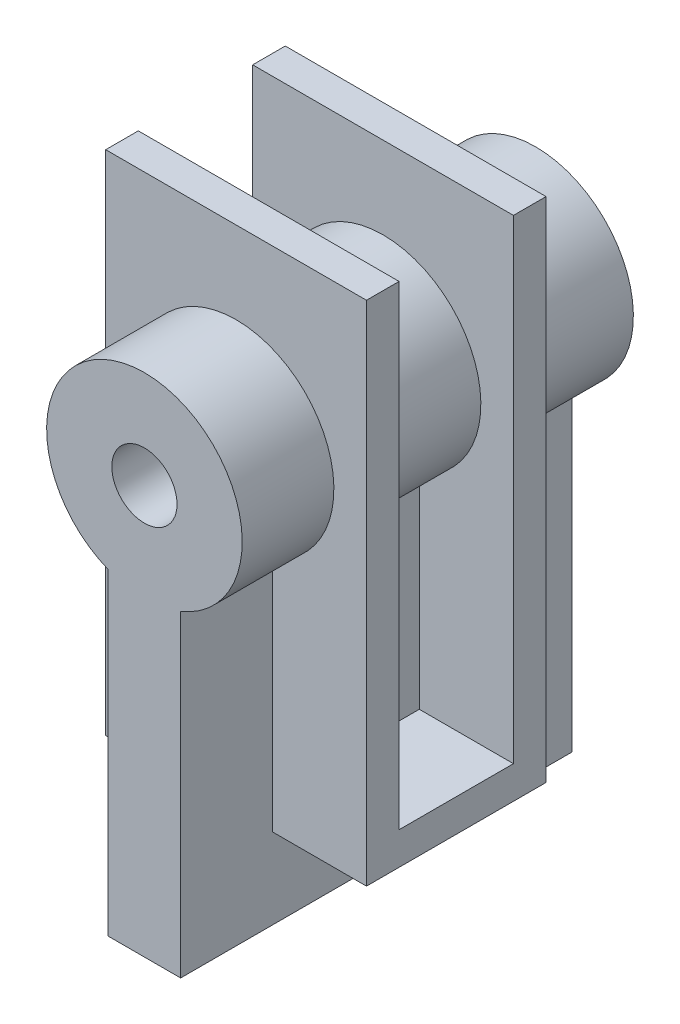
ISO-10303-21;
HEADER;
FILE_DESCRIPTION(('STEP AP214'),'2;1');
FILE_NAME('part.step','',(''),(''),'','','');
FILE_SCHEMA(('AUTOMOTIVE_DESIGN { 1 0 10303 214 1 1 1 1 }'));
ENDSEC;
DATA;
#1=APPLICATION_CONTEXT('core data for automotive mechanical design processes');
#2=APPLICATION_PROTOCOL_DEFINITION('international standard','automotive_design',2000,#1);
#3=PRODUCT_CONTEXT('',#1,'mechanical');
#4=PRODUCT('Part','Part','',(#3));
#5=PRODUCT_RELATED_PRODUCT_CATEGORY('part','',(#4));
#6=PRODUCT_DEFINITION_FORMATION('','',#4);
#7=PRODUCT_DEFINITION_CONTEXT('part definition',#1,'design');
#8=PRODUCT_DEFINITION('design','',#6,#7);
#9=PRODUCT_DEFINITION_SHAPE('','',#8);
#10=(LENGTH_UNIT() NAMED_UNIT(*) SI_UNIT(.MILLI.,.METRE.));
#11=(NAMED_UNIT(*) PLANE_ANGLE_UNIT() SI_UNIT($,.RADIAN.));
#12=(NAMED_UNIT(*) SI_UNIT($,.STERADIAN.) SOLID_ANGLE_UNIT());
#13=UNCERTAINTY_MEASURE_WITH_UNIT(LENGTH_MEASURE(1.E-05),#10,'distance_accuracy_value','');
#14=(GEOMETRIC_REPRESENTATION_CONTEXT(3) GLOBAL_UNCERTAINTY_ASSIGNED_CONTEXT((#13)) GLOBAL_UNIT_ASSIGNED_CONTEXT((#10,
#11,#12)) REPRESENTATION_CONTEXT('',''));
#15=CARTESIAN_POINT('',(0.,0.,0.));
#16=DIRECTION('',(0.,0.,1.));
#17=DIRECTION('',(1.,0.,0.));
#18=AXIS2_PLACEMENT_3D('',#15,#16,#17);
#19=CARTESIAN_POINT('',(0.,0.,-30.));
#20=DIRECTION('',(0.,0.,1.));
#21=DIRECTION('',(1.,0.,0.));
#22=AXIS2_PLACEMENT_3D('',#19,#20,#21);
#23=CYLINDRICAL_SURFACE('',#22,15.);
#24=CARTESIAN_POINT('',(0.,0.,15.9381302617935));
#25=DIRECTION('',(0.,0.,1.));
#26=DIRECTION('',(1.,0.,0.));
#27=AXIS2_PLACEMENT_3D('',#24,#25,#26);
#28=CIRCLE('',#27,15.);
#29=CARTESIAN_POINT('',(-5.5576064521285,-13.9324445279089,15.9381302617935));
#30=VERTEX_POINT('',#29);
#31=CARTESIAN_POINT('',(5.5576064521285,-13.9324445279089,15.9381302617935));
#32=VERTEX_POINT('',#31);
#33=EDGE_CURVE('E278',#30,#32,#28,.F.);
#34=ORIENTED_EDGE('',*,*,#33,.F.);
#35=DIRECTION('',(0.,0.,1.));
#36=VECTOR('',#35,1.);
#37=CARTESIAN_POINT('',(-5.5576064521285,-13.9324445279089,-30.));
#38=LINE('',#37,#36);
#39=CARTESIAN_POINT('',(-5.5576064521285,-13.9324445279089,30.));
#40=VERTEX_POINT('',#39);
#41=EDGE_CURVE('E333',#30,#40,#38,.T.);
#42=ORIENTED_EDGE('',*,*,#41,.T.);
#43=CARTESIAN_POINT('',(0.,0.,30.));
#44=DIRECTION('',(0.,0.,1.));
#45=DIRECTION('',(1.,0.,0.));
#46=AXIS2_PLACEMENT_3D('',#43,#44,#45);
#47=CIRCLE('',#46,15.);
#48=CARTESIAN_POINT('',(5.5576064521285,-13.9324445279089,30.));
#49=VERTEX_POINT('',#48);
#50=EDGE_CURVE('E306',#49,#40,#47,.T.);
#51=ORIENTED_EDGE('',*,*,#50,.F.);
#52=DIRECTION('',(0.,0.,1.));
#53=VECTOR('',#52,1.);
#54=CARTESIAN_POINT('',(5.5576064521285,-13.9324445279089,-30.));
#55=LINE('',#54,#53);
#56=EDGE_CURVE('E337',#32,#49,#55,.T.);
#57=ORIENTED_EDGE('',*,*,#56,.F.);
#58=EDGE_LOOP('',(#34,#42,#51,#57));
#59=FACE_BOUND('',#58,.T.);
#60=ADVANCED_FACE('F43',(#59),#23,.T.);
#61=CARTESIAN_POINT('',(5.5576064521285,-13.9324445279089,-30.));
#62=DIRECTION('',(1.,0.,0.));
#63=DIRECTION('',(0.,1.,0.));
#64=AXIS2_PLACEMENT_3D('',#61,#62,#63);
#65=PLANE('',#64);
#66=DIRECTION('',(0.,1.,0.));
#67=VECTOR('',#66,1.);
#68=CARTESIAN_POINT('',(5.5576064521285,-13.9324445279089,-11.6055019568257));
#69=LINE('',#68,#67);
#70=CARTESIAN_POINT('',(5.5576064521285,-50.2531458099855,-11.6055019568257));
#71=VERTEX_POINT('',#70);
#72=CARTESIAN_POINT('',(5.5576064521285,-13.9324445279089,-11.6055019568257));
#73=VERTEX_POINT('',#72);
#74=EDGE_CURVE('E59',#71,#73,#69,.T.);
#75=ORIENTED_EDGE('',*,*,#74,.F.);
#76=DIRECTION('',(0.,0.,-1.));
#77=VECTOR('',#76,1.);
#78=CARTESIAN_POINT('',(5.5576064521285,-50.2531458099855,-30.));
#79=LINE('',#78,#77);
#80=CARTESIAN_POINT('',(5.5576064521285,-50.2531458099855,15.9381302617935));
#81=VERTEX_POINT('',#80);
#82=EDGE_CURVE('E63',#81,#71,#79,.T.);
#83=ORIENTED_EDGE('',*,*,#82,.F.);
#84=DIRECTION('',(0.,-1.,0.));
#85=VECTOR('',#84,1.);
#86=CARTESIAN_POINT('',(5.5576064521285,-13.9324445279089,15.9381302617935));
#87=LINE('',#86,#85);
#88=EDGE_CURVE('E281',#32,#81,#87,.T.);
#89=ORIENTED_EDGE('',*,*,#88,.F.);
#90=ORIENTED_EDGE('',*,*,#56,.T.);
#91=DIRECTION('',(0.,1.,0.));
#92=VECTOR('',#91,1.);
#93=CARTESIAN_POINT('',(5.5576064521285,-13.9324445279089,30.));
#94=LINE('',#93,#92);
#95=CARTESIAN_POINT('',(5.5576064521285,-62.6422800075539,30.));
#96=VERTEX_POINT('',#95);
#97=EDGE_CURVE('E315',#96,#49,#94,.T.);
#98=ORIENTED_EDGE('',*,*,#97,.F.);
#99=DIRECTION('',(0.,0.,1.));
#100=VECTOR('',#99,1.);
#101=CARTESIAN_POINT('',(5.5576064521285,-62.6422800075539,-30.));
#102=LINE('',#101,#100);
#103=CARTESIAN_POINT('',(5.5576064521285,-62.6422800075539,-30.));
#104=VERTEX_POINT('',#103);
#105=EDGE_CURVE('E338',#104,#96,#102,.T.);
#106=ORIENTED_EDGE('',*,*,#105,.F.);
#107=DIRECTION('',(0.,1.,0.));
#108=VECTOR('',#107,1.);
#109=CARTESIAN_POINT('',(5.5576064521285,-13.9324445279089,-30.));
#110=LINE('',#109,#108);
#111=CARTESIAN_POINT('',(5.5576064521285,-13.9324445279089,-30.));
#112=VERTEX_POINT('',#111);
#113=EDGE_CURVE('E330',#104,#112,#110,.T.);
#114=ORIENTED_EDGE('',*,*,#113,.T.);
#115=EDGE_CURVE('E334',#112,#73,#55,.T.);
#116=ORIENTED_EDGE('',*,*,#115,.T.);
#117=EDGE_LOOP('',(#75,#83,#89,#90,#98,#106,#114,#116));
#118=FACE_BOUND('',#117,.T.);
#119=ADVANCED_FACE('F387',(#118),#65,.T.);
#120=CARTESIAN_POINT('',(-5.5576064521285,-13.9324445279089,-30.));
#121=DIRECTION('',(-1.,0.,0.));
#122=DIRECTION('',(0.,0.,1.));
#123=AXIS2_PLACEMENT_3D('',#120,#121,#122);
#124=PLANE('',#123);
#125=DIRECTION('',(0.,-1.,0.));
#126=VECTOR('',#125,1.);
#127=CARTESIAN_POINT('',(-5.5576064521285,-13.9324445279089,-11.6055019568257));
#128=LINE('',#127,#126);
#129=CARTESIAN_POINT('',(-5.5576064521285,-13.9324445279089,-11.6055019568257));
#130=VERTEX_POINT('',#129);
#131=CARTESIAN_POINT('',(-5.5576064521285,-50.2531458099855,-11.6055019568257));
#132=VERTEX_POINT('',#131);
#133=EDGE_CURVE('E284',#130,#132,#128,.T.);
#134=ORIENTED_EDGE('',*,*,#133,.F.);
#135=CARTESIAN_POINT('',(-5.5576064521285,-13.9324445279089,-30.));
#136=VERTEX_POINT('',#135);
#137=EDGE_CURVE('E342',#136,#130,#38,.T.);
#138=ORIENTED_EDGE('',*,*,#137,.F.);
#139=DIRECTION('',(0.,-1.,0.));
#140=VECTOR('',#139,1.);
#141=CARTESIAN_POINT('',(-5.5576064521285,-13.9324445279089,-30.));
#142=LINE('',#141,#140);
#143=CARTESIAN_POINT('',(-5.5576064521285,-62.6422800075539,-30.));
#144=VERTEX_POINT('',#143);
#145=EDGE_CURVE('E324',#136,#144,#142,.T.);
#146=ORIENTED_EDGE('',*,*,#145,.T.);
#147=DIRECTION('',(0.,0.,1.));
#148=VECTOR('',#147,1.);
#149=CARTESIAN_POINT('',(-5.5576064521285,-62.6422800075539,-30.));
#150=LINE('',#149,#148);
#151=CARTESIAN_POINT('',(-5.5576064521285,-62.6422800075539,30.));
#152=VERTEX_POINT('',#151);
#153=EDGE_CURVE('E340',#144,#152,#150,.T.);
#154=ORIENTED_EDGE('',*,*,#153,.T.);
#155=DIRECTION('',(0.,-1.,0.));
#156=VECTOR('',#155,1.);
#157=CARTESIAN_POINT('',(-5.5576064521285,-13.9324445279089,30.));
#158=LINE('',#157,#156);
#159=EDGE_CURVE('E309',#40,#152,#158,.T.);
#160=ORIENTED_EDGE('',*,*,#159,.F.);
#161=ORIENTED_EDGE('',*,*,#41,.F.);
#162=DIRECTION('',(0.,1.,0.));
#163=VECTOR('',#162,1.);
#164=CARTESIAN_POINT('',(-5.5576064521285,-13.9324445279089,15.9381302617935));
#165=LINE('',#164,#163);
#166=CARTESIAN_POINT('',(-5.5576064521285,-50.2531458099855,15.9381302617935));
#167=VERTEX_POINT('',#166);
#168=EDGE_CURVE('E275',#167,#30,#165,.T.);
#169=ORIENTED_EDGE('',*,*,#168,.F.);
#170=DIRECTION('',(0.,0.,1.));
#171=VECTOR('',#170,1.);
#172=CARTESIAN_POINT('',(-5.5576064521285,-50.2531458099855,-30.));
#173=LINE('',#172,#171);
#174=EDGE_CURVE('E11',#132,#167,#173,.T.);
#175=ORIENTED_EDGE('',*,*,#174,.F.);
#176=EDGE_LOOP('',(#134,#138,#146,#154,#160,#161,#169,#175));
#177=FACE_BOUND('',#176,.T.);
#178=ADVANCED_FACE('F381',(#177),#124,.T.);
#179=CARTESIAN_POINT('',(0.,0.,-30.));
#180=DIRECTION('',(0.,0.,1.));
#181=DIRECTION('',(1.,0.,0.));
#182=AXIS2_PLACEMENT_3D('',#179,#180,#181);
#183=CYLINDRICAL_SURFACE('',#182,5.);
#184=CARTESIAN_POINT('',(0.,0.,15.9381302617935));
#185=DIRECTION('',(0.,0.,1.));
#186=DIRECTION('',(1.,0.,0.));
#187=AXIS2_PLACEMENT_3D('',#184,#185,#186);
#188=CIRCLE('',#187,5.);
#189=CARTESIAN_POINT('',(5.,0.,15.9381302617935));
#190=VERTEX_POINT('',#189);
#191=EDGE_CURVE('E274',#190,#190,#188,.F.);
#192=ORIENTED_EDGE('',*,*,#191,.T.);
#193=EDGE_LOOP('',(#192));
#194=FACE_BOUND('',#193,.T.);
#195=CARTESIAN_POINT('',(0.,0.,30.));
#196=DIRECTION('',(0.,0.,1.));
#197=DIRECTION('',(1.,0.,0.));
#198=AXIS2_PLACEMENT_3D('',#195,#196,#197);
#199=CIRCLE('',#198,5.);
#200=CARTESIAN_POINT('',(5.,0.,30.));
#201=VERTEX_POINT('',#200);
#202=EDGE_CURVE('E303',#201,#201,#199,.T.);
#203=ORIENTED_EDGE('',*,*,#202,.T.);
#204=EDGE_LOOP('',(#203));
#205=FACE_BOUND('',#204,.T.);
#206=ADVANCED_FACE('F405',(#194,#205),#183,.F.);
#207=CARTESIAN_POINT('',(0.,0.,-11.6055019568257));
#208=DIRECTION('',(0.,0.,-1.));
#209=DIRECTION('',(-1.,0.,0.));
#210=AXIS2_PLACEMENT_3D('',#207,#208,#209);
#211=CIRCLE('',#210,15.);
#212=EDGE_CURVE('E287',#73,#130,#211,.F.);
#213=ORIENTED_EDGE('',*,*,#212,.F.);
#214=ORIENTED_EDGE('',*,*,#115,.F.);
#215=CARTESIAN_POINT('',(0.,0.,-30.));
#216=DIRECTION('',(0.,0.,1.));
#217=DIRECTION('',(1.,0.,0.));
#218=AXIS2_PLACEMENT_3D('',#215,#216,#217);
#219=CIRCLE('',#218,15.);
#220=EDGE_CURVE('E321',#112,#136,#219,.T.);
#221=ORIENTED_EDGE('',*,*,#220,.T.);
#222=ORIENTED_EDGE('',*,*,#137,.T.);
#223=EDGE_LOOP('',(#213,#214,#221,#222));
#224=FACE_BOUND('',#223,.T.);
#225=ADVANCED_FACE('F45',(#224),#23,.T.);
#226=CARTESIAN_POINT('',(-5.5576064521285,-62.6422800075539,-30.));
#227=DIRECTION('',(0.,-1.,0.));
#228=DIRECTION('',(0.,0.,-1.));
#229=AXIS2_PLACEMENT_3D('',#226,#227,#228);
#230=PLANE('',#229);
#231=ORIENTED_EDGE('',*,*,#105,.T.);
#232=DIRECTION('',(1.,0.,0.));
#233=VECTOR('',#232,1.);
#234=CARTESIAN_POINT('',(-5.5576064521285,-62.6422800075539,30.));
#235=LINE('',#234,#233);
#236=EDGE_CURVE('E312',#152,#96,#235,.T.);
#237=ORIENTED_EDGE('',*,*,#236,.F.);
#238=ORIENTED_EDGE('',*,*,#153,.F.);
#239=DIRECTION('',(1.,0.,0.));
#240=VECTOR('',#239,1.);
#241=CARTESIAN_POINT('',(-5.5576064521285,-62.6422800075539,-30.));
#242=LINE('',#241,#240);
#243=EDGE_CURVE('E327',#144,#104,#242,.T.);
#244=ORIENTED_EDGE('',*,*,#243,.T.);
#245=EDGE_LOOP('',(#231,#237,#238,#244));
#246=FACE_BOUND('',#245,.T.);
#247=ADVANCED_FACE('F404',(#246),#230,.T.);
#248=CARTESIAN_POINT('',(0.,0.,-30.));
#249=DIRECTION('',(0.,0.,1.));
#250=DIRECTION('',(1.,0.,0.));
#251=AXIS2_PLACEMENT_3D('',#248,#249,#250);
#252=PLANE('',#251);
#253=CARTESIAN_POINT('',(0.,0.,-30.));
#254=DIRECTION('',(0.,0.,1.));
#255=DIRECTION('',(1.,0.,0.));
#256=AXIS2_PLACEMENT_3D('',#253,#254,#255);
#257=CIRCLE('',#256,5.);
#258=CARTESIAN_POINT('',(5.,0.,-30.));
#259=VERTEX_POINT('',#258);
#260=EDGE_CURVE('E318',#259,#259,#257,.T.);
#261=ORIENTED_EDGE('',*,*,#260,.T.);
#262=EDGE_LOOP('',(#261));
#263=FACE_BOUND('',#262,.T.);
#264=ORIENTED_EDGE('',*,*,#220,.F.);
#265=ORIENTED_EDGE('',*,*,#113,.F.);
#266=ORIENTED_EDGE('',*,*,#243,.F.);
#267=ORIENTED_EDGE('',*,*,#145,.F.);
#268=EDGE_LOOP('',(#264,#265,#266,#267));
#269=FACE_BOUND('',#268,.T.);
#270=ADVANCED_FACE('F593',(#263,#269),#252,.F.);
#271=CARTESIAN_POINT('',(0.,0.,-11.6055019568257));
#272=DIRECTION('',(0.,0.,-1.));
#273=DIRECTION('',(-1.,0.,0.));
#274=AXIS2_PLACEMENT_3D('',#271,#272,#273);
#275=CIRCLE('',#274,5.);
#276=CARTESIAN_POINT('',(-5.,0.,-11.6055019568257));
#277=VERTEX_POINT('',#276);
#278=EDGE_CURVE('E283',#277,#277,#275,.F.);
#279=ORIENTED_EDGE('',*,*,#278,.T.);
#280=EDGE_LOOP('',(#279));
#281=FACE_BOUND('',#280,.T.);
#282=ORIENTED_EDGE('',*,*,#260,.F.);
#283=EDGE_LOOP('',(#282));
#284=FACE_BOUND('',#283,.T.);
#285=ADVANCED_FACE('F421',(#281,#284),#183,.F.);
#286=CARTESIAN_POINT('',(0.,0.,30.));
#287=DIRECTION('',(0.,0.,1.));
#288=DIRECTION('',(1.,0.,0.));
#289=AXIS2_PLACEMENT_3D('',#286,#287,#288);
#290=PLANE('',#289);
#291=ORIENTED_EDGE('',*,*,#50,.T.);
#292=ORIENTED_EDGE('',*,*,#159,.T.);
#293=ORIENTED_EDGE('',*,*,#236,.T.);
#294=ORIENTED_EDGE('',*,*,#97,.T.);
#295=EDGE_LOOP('',(#291,#292,#293,#294));
#296=FACE_BOUND('',#295,.T.);
#297=ORIENTED_EDGE('',*,*,#202,.F.);
#298=EDGE_LOOP('',(#297));
#299=FACE_BOUND('',#298,.T.);
#300=ADVANCED_FACE('F384',(#296,#299),#290,.T.);
#301=CARTESIAN_POINT('',(-20.,-50.2531458099855,15.9381302617935));
#302=DIRECTION('',(0.,0.,1.));
#303=DIRECTION('',(1.,0.,0.));
#304=AXIS2_PLACEMENT_3D('',#301,#302,#303);
#305=PLANE('',#304);
#306=ORIENTED_EDGE('',*,*,#191,.F.);
#307=EDGE_LOOP('',(#306));
#308=FACE_BOUND('',#307,.T.);
#309=ADVANCED_FACE('F514',(#308),#305,.T.);
#310=CARTESIAN_POINT('',(-20.,-50.2531458099855,-11.6055019568257));
#311=DIRECTION('',(0.,0.,-1.));
#312=DIRECTION('',(-1.,0.,0.));
#313=AXIS2_PLACEMENT_3D('',#310,#311,#312);
#314=PLANE('',#313);
#315=ORIENTED_EDGE('',*,*,#278,.F.);
#316=EDGE_LOOP('',(#315));
#317=FACE_BOUND('',#316,.T.);
#318=ADVANCED_FACE('F536',(#317),#314,.T.);
#319=CARTESIAN_POINT('',(-20.,-45.2531458099855,-6.6055019568257));
#320=DIRECTION('',(0.,1.,0.));
#321=DIRECTION('',(0.,0.,1.));
#322=AXIS2_PLACEMENT_3D('',#319,#320,#321);
#323=PLANE('',#322);
#324=DIRECTION('',(1.,0.,0.));
#325=VECTOR('',#324,1.);
#326=CARTESIAN_POINT('',(-20.,-45.2531458099855,-6.6055019568257));
#327=LINE('',#326,#325);
#328=CARTESIAN_POINT('',(5.5576064521285,-45.2531458099855,-6.6055019568257));
#329=VERTEX_POINT('',#328);
#330=CARTESIAN_POINT('',(20.,-45.2531458099855,-6.6055019568257));
#331=VERTEX_POINT('',#330);
#332=EDGE_CURVE('E249',#329,#331,#327,.T.);
#333=ORIENTED_EDGE('',*,*,#332,.F.);
#334=DIRECTION('',(0.,0.,1.));
#335=VECTOR('',#334,1.);
#336=CARTESIAN_POINT('',(5.5576064521285,-45.2531458099855,-30.));
#337=LINE('',#336,#335);
#338=CARTESIAN_POINT('',(5.5576064521285,-45.2531458099855,10.9381302617935));
#339=VERTEX_POINT('',#338);
#340=EDGE_CURVE('E187',#329,#339,#337,.T.);
#341=ORIENTED_EDGE('',*,*,#340,.T.);
#342=DIRECTION('',(1.,0.,0.));
#343=VECTOR('',#342,1.);
#344=CARTESIAN_POINT('',(-20.,-45.2531458099855,10.9381302617935));
#345=LINE('',#344,#343);
#346=CARTESIAN_POINT('',(20.,-45.2531458099855,10.9381302617935));
#347=VERTEX_POINT('',#346);
#348=EDGE_CURVE('E181',#339,#347,#345,.T.);
#349=ORIENTED_EDGE('',*,*,#348,.T.);
#350=DIRECTION('',(0.,0.,1.));
#351=VECTOR('',#350,1.);
#352=CARTESIAN_POINT('',(20.,-45.2531458099855,-6.6055019568257));
#353=LINE('',#352,#351);
#354=EDGE_CURVE('E186',#331,#347,#353,.T.);
#355=ORIENTED_EDGE('',*,*,#354,.F.);
#356=EDGE_LOOP('',(#333,#341,#349,#355));
#357=FACE_BOUND('',#356,.T.);
#358=ADVANCED_FACE('F184',(#357),#323,.T.);
#359=CARTESIAN_POINT('',(-20.,-50.2531458099855,-11.6055019568257));
#360=DIRECTION('',(0.,-1.,0.));
#361=DIRECTION('',(0.,0.,-1.));
#362=AXIS2_PLACEMENT_3D('',#359,#360,#361);
#363=PLANE('',#362);
#364=DIRECTION('',(1.,0.,0.));
#365=VECTOR('',#364,1.);
#366=CARTESIAN_POINT('',(-20.,-50.2531458099855,15.9381302617935));
#367=LINE('',#366,#365);
#368=CARTESIAN_POINT('',(20.,-50.2531458099855,15.9381302617935));
#369=VERTEX_POINT('',#368);
#370=EDGE_CURVE('E261',#81,#369,#367,.T.);
#371=ORIENTED_EDGE('',*,*,#370,.F.);
#372=ORIENTED_EDGE('',*,*,#82,.T.);
#373=DIRECTION('',(1.,0.,0.));
#374=VECTOR('',#373,1.);
#375=CARTESIAN_POINT('',(-20.,-50.2531458099855,-11.6055019568257));
#376=LINE('',#375,#374);
#377=CARTESIAN_POINT('',(20.,-50.2531458099855,-11.6055019568257));
#378=VERTEX_POINT('',#377);
#379=EDGE_CURVE('E257',#71,#378,#376,.T.);
#380=ORIENTED_EDGE('',*,*,#379,.T.);
#381=DIRECTION('',(0.,0.,-1.));
#382=VECTOR('',#381,1.);
#383=CARTESIAN_POINT('',(20.,-50.2531458099855,-11.6055019568257));
#384=LINE('',#383,#382);
#385=EDGE_CURVE('E214',#369,#378,#384,.T.);
#386=ORIENTED_EDGE('',*,*,#385,.F.);
#387=EDGE_LOOP('',(#371,#372,#380,#386));
#388=FACE_BOUND('',#387,.T.);
#389=ADVANCED_FACE('F525',(#388),#363,.T.);
#390=CARTESIAN_POINT('',(-20.,-45.2531458099855,10.9381302617935));
#391=VERTEX_POINT('',#390);
#392=CARTESIAN_POINT('',(-5.5576064521285,-45.2531458099855,10.9381302617935));
#393=VERTEX_POINT('',#392);
#394=EDGE_CURVE('E190',#391,#393,#345,.T.);
#395=ORIENTED_EDGE('',*,*,#394,.T.);
#396=DIRECTION('',(0.,0.,-1.));
#397=VECTOR('',#396,1.);
#398=CARTESIAN_POINT('',(-5.5576064521285,-45.2531458099855,-30.));
#399=LINE('',#398,#397);
#400=CARTESIAN_POINT('',(-5.5576064521285,-45.2531458099855,-6.6055019568257));
#401=VERTEX_POINT('',#400);
#402=EDGE_CURVE('E52',#393,#401,#399,.T.);
#403=ORIENTED_EDGE('',*,*,#402,.T.);
#404=CARTESIAN_POINT('',(-20.,-45.2531458099855,-6.6055019568257));
#405=VERTEX_POINT('',#404);
#406=EDGE_CURVE('E245',#405,#401,#327,.T.);
#407=ORIENTED_EDGE('',*,*,#406,.F.);
#408=DIRECTION('',(0.,0.,1.));
#409=VECTOR('',#408,1.);
#410=CARTESIAN_POINT('',(-20.,-45.2531458099855,-6.6055019568257));
#411=LINE('',#410,#409);
#412=EDGE_CURVE('E223',#405,#391,#411,.T.);
#413=ORIENTED_EDGE('',*,*,#412,.T.);
#414=EDGE_LOOP('',(#395,#403,#407,#413));
#415=FACE_BOUND('',#414,.T.);
#416=ADVANCED_FACE('F355',(#415),#323,.T.);
#417=CARTESIAN_POINT('',(-20.,-45.2531458099855,-6.6055019568257));
#418=DIRECTION('',(0.,0.,1.));
#419=DIRECTION('',(1.,0.,0.));
#420=AXIS2_PLACEMENT_3D('',#417,#418,#419);
#421=PLANE('',#420);
#422=CARTESIAN_POINT('',(0.,0.,-6.6055019568257));
#423=DIRECTION('',(0.,0.,1.));
#424=DIRECTION('',(1.,0.,0.));
#425=AXIS2_PLACEMENT_3D('',#422,#423,#424);
#426=CIRCLE('',#425,15.);
#427=CARTESIAN_POINT('',(-5.5576064521285,-13.9324445279089,-6.6055019568257));
#428=VERTEX_POINT('',#427);
#429=CARTESIAN_POINT('',(5.5576064521285,-13.9324445279089,-6.6055019568257));
#430=VERTEX_POINT('',#429);
#431=EDGE_CURVE('E295',#428,#430,#426,.F.);
#432=ORIENTED_EDGE('',*,*,#431,.T.);
#433=DIRECTION('',(0.,-1.,0.));
#434=VECTOR('',#433,1.);
#435=CARTESIAN_POINT('',(5.5576064521285,-13.9324445279089,-6.6055019568257));
#436=LINE('',#435,#434);
#437=EDGE_CURVE('E298',#430,#329,#436,.T.);
#438=ORIENTED_EDGE('',*,*,#437,.T.);
#439=ORIENTED_EDGE('',*,*,#332,.T.);
#440=DIRECTION('',(0.,-1.,0.));
#441=VECTOR('',#440,1.);
#442=CARTESIAN_POINT('',(20.,-45.2531458099855,-6.6055019568257));
#443=LINE('',#442,#441);
#444=CARTESIAN_POINT('',(20.,27.5804653060911,-6.6055019568257));
#445=VERTEX_POINT('',#444);
#446=EDGE_CURVE('E207',#445,#331,#443,.T.);
#447=ORIENTED_EDGE('',*,*,#446,.F.);
#448=DIRECTION('',(1.,0.,0.));
#449=VECTOR('',#448,1.);
#450=CARTESIAN_POINT('',(-20.,27.5804653060911,-6.6055019568257));
#451=LINE('',#450,#449);
#452=CARTESIAN_POINT('',(-20.,27.5804653060911,-6.6055019568257));
#453=VERTEX_POINT('',#452);
#454=EDGE_CURVE('E250',#453,#445,#451,.T.);
#455=ORIENTED_EDGE('',*,*,#454,.F.);
#456=DIRECTION('',(0.,-1.,0.));
#457=VECTOR('',#456,1.);
#458=CARTESIAN_POINT('',(-20.,-45.2531458099855,-6.6055019568257));
#459=LINE('',#458,#457);
#460=EDGE_CURVE('E191',#453,#405,#459,.T.);
#461=ORIENTED_EDGE('',*,*,#460,.T.);
#462=ORIENTED_EDGE('',*,*,#406,.T.);
#463=DIRECTION('',(0.,1.,0.));
#464=VECTOR('',#463,1.);
#465=CARTESIAN_POINT('',(-5.5576064521285,-13.9324445279089,-6.6055019568257));
#466=LINE('',#465,#464);
#467=EDGE_CURVE('E292',#401,#428,#466,.T.);
#468=ORIENTED_EDGE('',*,*,#467,.T.);
#469=EDGE_LOOP('',(#432,#438,#439,#447,#455,#461,#462,#468));
#470=FACE_BOUND('',#469,.T.);
#471=ADVANCED_FACE('F359',(#470),#421,.T.);
#472=CARTESIAN_POINT('',(-20.,27.5804653060911,-6.6055019568257));
#473=DIRECTION('',(0.,1.,0.));
#474=DIRECTION('',(0.,0.,1.));
#475=AXIS2_PLACEMENT_3D('',#472,#473,#474);
#476=PLANE('',#475);
#477=ORIENTED_EDGE('',*,*,#454,.T.);
#478=DIRECTION('',(0.,0.,1.));
#479=VECTOR('',#478,1.);
#480=CARTESIAN_POINT('',(20.,27.5804653060911,-6.6055019568257));
#481=LINE('',#480,#479);
#482=CARTESIAN_POINT('',(20.,27.5804653060911,-11.6055019568257));
#483=VERTEX_POINT('',#482);
#484=EDGE_CURVE('E220',#483,#445,#481,.T.);
#485=ORIENTED_EDGE('',*,*,#484,.F.);
#486=DIRECTION('',(1.,0.,0.));
#487=VECTOR('',#486,1.);
#488=CARTESIAN_POINT('',(-20.,27.5804653060911,-11.6055019568257));
#489=LINE('',#488,#487);
#490=CARTESIAN_POINT('',(-20.,27.5804653060911,-11.6055019568257));
#491=VERTEX_POINT('',#490);
#492=EDGE_CURVE('E252',#491,#483,#489,.T.);
#493=ORIENTED_EDGE('',*,*,#492,.F.);
#494=DIRECTION('',(0.,0.,1.));
#495=VECTOR('',#494,1.);
#496=CARTESIAN_POINT('',(-20.,27.5804653060911,-6.6055019568257));
#497=LINE('',#496,#495);
#498=EDGE_CURVE('E240',#491,#453,#497,.T.);
#499=ORIENTED_EDGE('',*,*,#498,.T.);
#500=EDGE_LOOP('',(#477,#485,#493,#499));
#501=FACE_BOUND('',#500,.T.);
#502=ADVANCED_FACE('F533',(#501),#476,.T.);
#503=ORIENTED_EDGE('',*,*,#379,.F.);
#504=ORIENTED_EDGE('',*,*,#74,.T.);
#505=ORIENTED_EDGE('',*,*,#212,.T.);
#506=ORIENTED_EDGE('',*,*,#133,.T.);
#507=CARTESIAN_POINT('',(-20.,-50.2531458099855,-11.6055019568257));
#508=VERTEX_POINT('',#507);
#509=EDGE_CURVE('E254',#508,#132,#376,.T.);
#510=ORIENTED_EDGE('',*,*,#509,.F.);
#511=DIRECTION('',(0.,1.,0.));
#512=VECTOR('',#511,1.);
#513=CARTESIAN_POINT('',(-20.,-50.2531458099855,-11.6055019568257));
#514=LINE('',#513,#512);
#515=EDGE_CURVE('E237',#508,#491,#514,.T.);
#516=ORIENTED_EDGE('',*,*,#515,.T.);
#517=ORIENTED_EDGE('',*,*,#492,.T.);
#518=DIRECTION('',(0.,1.,0.));
#519=VECTOR('',#518,1.);
#520=CARTESIAN_POINT('',(20.,-50.2531458099855,-11.6055019568257));
#521=LINE('',#520,#519);
#522=EDGE_CURVE('E217',#378,#483,#521,.T.);
#523=ORIENTED_EDGE('',*,*,#522,.F.);
#524=EDGE_LOOP('',(#503,#504,#505,#506,#510,#516,#517,#523));
#525=FACE_BOUND('',#524,.T.);
#526=ADVANCED_FACE('F522',(#525),#314,.T.);
#527=ORIENTED_EDGE('',*,*,#509,.T.);
#528=ORIENTED_EDGE('',*,*,#174,.T.);
#529=CARTESIAN_POINT('',(-20.,-50.2531458099855,15.9381302617935));
#530=VERTEX_POINT('',#529);
#531=EDGE_CURVE('E258',#530,#167,#367,.T.);
#532=ORIENTED_EDGE('',*,*,#531,.F.);
#533=DIRECTION('',(0.,0.,-1.));
#534=VECTOR('',#533,1.);
#535=CARTESIAN_POINT('',(-20.,-50.2531458099855,-11.6055019568257));
#536=LINE('',#535,#534);
#537=EDGE_CURVE('E234',#530,#508,#536,.T.);
#538=ORIENTED_EDGE('',*,*,#537,.T.);
#539=EDGE_LOOP('',(#527,#528,#532,#538));
#540=FACE_BOUND('',#539,.T.);
#541=ADVANCED_FACE('F511',(#540),#363,.T.);
#542=ORIENTED_EDGE('',*,*,#33,.T.);
#543=ORIENTED_EDGE('',*,*,#88,.T.);
#544=ORIENTED_EDGE('',*,*,#370,.T.);
#545=DIRECTION('',(0.,-1.,0.));
#546=VECTOR('',#545,1.);
#547=CARTESIAN_POINT('',(20.,-50.2531458099855,15.9381302617935));
#548=LINE('',#547,#546);
#549=CARTESIAN_POINT('',(20.,27.5804653060911,15.9381302617935));
#550=VERTEX_POINT('',#549);
#551=EDGE_CURVE('E211',#550,#369,#548,.T.);
#552=ORIENTED_EDGE('',*,*,#551,.F.);
#553=DIRECTION('',(1.,0.,0.));
#554=VECTOR('',#553,1.);
#555=CARTESIAN_POINT('',(-20.,27.5804653060911,15.9381302617935));
#556=LINE('',#555,#554);
#557=CARTESIAN_POINT('',(-20.,27.5804653060911,15.9381302617935));
#558=VERTEX_POINT('',#557);
#559=EDGE_CURVE('E262',#558,#550,#556,.T.);
#560=ORIENTED_EDGE('',*,*,#559,.F.);
#561=DIRECTION('',(0.,-1.,0.));
#562=VECTOR('',#561,1.);
#563=CARTESIAN_POINT('',(-20.,-50.2531458099855,15.9381302617935));
#564=LINE('',#563,#562);
#565=EDGE_CURVE('E231',#558,#530,#564,.T.);
#566=ORIENTED_EDGE('',*,*,#565,.T.);
#567=ORIENTED_EDGE('',*,*,#531,.T.);
#568=ORIENTED_EDGE('',*,*,#168,.T.);
#569=EDGE_LOOP('',(#542,#543,#544,#552,#560,#566,#567,#568));
#570=FACE_BOUND('',#569,.T.);
#571=ADVANCED_FACE('F501',(#570),#305,.T.);
#572=CARTESIAN_POINT('',(-20.,27.5804653060911,15.9381302617935));
#573=DIRECTION('',(0.,1.,0.));
#574=DIRECTION('',(0.,0.,1.));
#575=AXIS2_PLACEMENT_3D('',#572,#573,#574);
#576=PLANE('',#575);
#577=ORIENTED_EDGE('',*,*,#559,.T.);
#578=DIRECTION('',(0.,0.,1.));
#579=VECTOR('',#578,1.);
#580=CARTESIAN_POINT('',(20.,27.5804653060911,15.9381302617935));
#581=LINE('',#580,#579);
#582=CARTESIAN_POINT('',(20.,27.5804653060911,10.9381302617935));
#583=VERTEX_POINT('',#582);
#584=EDGE_CURVE('E201',#583,#550,#581,.T.);
#585=ORIENTED_EDGE('',*,*,#584,.F.);
#586=DIRECTION('',(1.,0.,0.));
#587=VECTOR('',#586,1.);
#588=CARTESIAN_POINT('',(-20.,27.5804653060911,10.9381302617935));
#589=LINE('',#588,#587);
#590=CARTESIAN_POINT('',(-20.,27.5804653060911,10.9381302617935));
#591=VERTEX_POINT('',#590);
#592=EDGE_CURVE('E197',#591,#583,#589,.T.);
#593=ORIENTED_EDGE('',*,*,#592,.F.);
#594=DIRECTION('',(0.,0.,1.));
#595=VECTOR('',#594,1.);
#596=CARTESIAN_POINT('',(-20.,27.5804653060911,15.9381302617935));
#597=LINE('',#596,#595);
#598=EDGE_CURVE('E228',#591,#558,#597,.T.);
#599=ORIENTED_EDGE('',*,*,#598,.T.);
#600=EDGE_LOOP('',(#577,#585,#593,#599));
#601=FACE_BOUND('',#600,.T.);
#602=ADVANCED_FACE('F493',(#601),#576,.T.);
#603=CARTESIAN_POINT('',(-20.,-45.2531458099855,10.9381302617935));
#604=DIRECTION('',(0.,0.,-1.));
#605=DIRECTION('',(-1.,0.,0.));
#606=AXIS2_PLACEMENT_3D('',#603,#604,#605);
#607=PLANE('',#606);
#608=ORIENTED_EDGE('',*,*,#348,.F.);
#609=DIRECTION('',(0.,1.,0.));
#610=VECTOR('',#609,1.);
#611=CARTESIAN_POINT('',(5.5576064521285,-13.9324445279089,10.9381302617935));
#612=LINE('',#611,#610);
#613=CARTESIAN_POINT('',(5.5576064521285,-13.9324445279089,10.9381302617935));
#614=VERTEX_POINT('',#613);
#615=EDGE_CURVE('E272',#339,#614,#612,.T.);
#616=ORIENTED_EDGE('',*,*,#615,.T.);
#617=CARTESIAN_POINT('',(0.,0.,10.9381302617935));
#618=DIRECTION('',(0.,0.,-1.));
#619=DIRECTION('',(-1.,0.,0.));
#620=AXIS2_PLACEMENT_3D('',#617,#618,#619);
#621=CIRCLE('',#620,15.);
#622=CARTESIAN_POINT('',(-5.5576064521285,-13.9324445279089,10.9381302617935));
#623=VERTEX_POINT('',#622);
#624=EDGE_CURVE('E269',#614,#623,#621,.F.);
#625=ORIENTED_EDGE('',*,*,#624,.T.);
#626=DIRECTION('',(0.,-1.,0.));
#627=VECTOR('',#626,1.);
#628=CARTESIAN_POINT('',(-5.5576064521285,-13.9324445279089,10.9381302617935));
#629=LINE('',#628,#627);
#630=EDGE_CURVE('E266',#623,#393,#629,.T.);
#631=ORIENTED_EDGE('',*,*,#630,.T.);
#632=ORIENTED_EDGE('',*,*,#394,.F.);
#633=DIRECTION('',(0.,1.,0.));
#634=VECTOR('',#633,1.);
#635=CARTESIAN_POINT('',(-20.,-45.2531458099855,10.9381302617935));
#636=LINE('',#635,#634);
#637=EDGE_CURVE('E226',#391,#591,#636,.T.);
#638=ORIENTED_EDGE('',*,*,#637,.T.);
#639=ORIENTED_EDGE('',*,*,#592,.T.);
#640=DIRECTION('',(0.,1.,0.));
#641=VECTOR('',#640,1.);
#642=CARTESIAN_POINT('',(20.,-45.2531458099855,10.9381302617935));
#643=LINE('',#642,#641);
#644=EDGE_CURVE('E194',#347,#583,#643,.T.);
#645=ORIENTED_EDGE('',*,*,#644,.F.);
#646=EDGE_LOOP('',(#608,#616,#625,#631,#632,#638,#639,#645));
#647=FACE_BOUND('',#646,.T.);
#648=ADVANCED_FACE('F195',(#647),#607,.T.);
#649=CARTESIAN_POINT('',(-20.,0.,-70.));
#650=DIRECTION('',(-1.,0.,0.));
#651=DIRECTION('',(0.,0.,1.));
#652=AXIS2_PLACEMENT_3D('',#649,#650,#651);
#653=PLANE('',#652);
#654=ORIENTED_EDGE('',*,*,#412,.F.);
#655=ORIENTED_EDGE('',*,*,#460,.F.);
#656=ORIENTED_EDGE('',*,*,#498,.F.);
#657=ORIENTED_EDGE('',*,*,#515,.F.);
#658=ORIENTED_EDGE('',*,*,#537,.F.);
#659=ORIENTED_EDGE('',*,*,#565,.F.);
#660=ORIENTED_EDGE('',*,*,#598,.F.);
#661=ORIENTED_EDGE('',*,*,#637,.F.);
#662=EDGE_LOOP('',(#654,#655,#656,#657,#658,#659,#660,#661));
#663=FACE_BOUND('',#662,.T.);
#664=ADVANCED_FACE('F363',(#663),#653,.T.);
#665=CARTESIAN_POINT('',(20.,0.,-70.));
#666=DIRECTION('',(-1.,0.,0.));
#667=DIRECTION('',(0.,0.,1.));
#668=AXIS2_PLACEMENT_3D('',#665,#666,#667);
#669=PLANE('',#668);
#670=ORIENTED_EDGE('',*,*,#354,.T.);
#671=ORIENTED_EDGE('',*,*,#644,.T.);
#672=ORIENTED_EDGE('',*,*,#584,.T.);
#673=ORIENTED_EDGE('',*,*,#551,.T.);
#674=ORIENTED_EDGE('',*,*,#385,.T.);
#675=ORIENTED_EDGE('',*,*,#522,.T.);
#676=ORIENTED_EDGE('',*,*,#484,.T.);
#677=ORIENTED_EDGE('',*,*,#446,.T.);
#678=EDGE_LOOP('',(#670,#671,#672,#673,#674,#675,#676,#677));
#679=FACE_BOUND('',#678,.T.);
#680=ADVANCED_FACE('F204',(#679),#669,.F.);
#681=ORIENTED_EDGE('',*,*,#437,.F.);
#682=EDGE_CURVE('E336',#430,#614,#55,.T.);
#683=ORIENTED_EDGE('',*,*,#682,.T.);
#684=ORIENTED_EDGE('',*,*,#615,.F.);
#685=ORIENTED_EDGE('',*,*,#340,.F.);
#686=EDGE_LOOP('',(#681,#683,#684,#685));
#687=FACE_BOUND('',#686,.T.);
#688=ADVANCED_FACE('F389',(#687),#65,.T.);
#689=ORIENTED_EDGE('',*,*,#467,.F.);
#690=ORIENTED_EDGE('',*,*,#402,.F.);
#691=ORIENTED_EDGE('',*,*,#630,.F.);
#692=EDGE_CURVE('E345',#428,#623,#38,.T.);
#693=ORIENTED_EDGE('',*,*,#692,.F.);
#694=EDGE_LOOP('',(#689,#690,#691,#693));
#695=FACE_BOUND('',#694,.T.);
#696=ADVANCED_FACE('F370',(#695),#124,.T.);
#697=ORIENTED_EDGE('',*,*,#431,.F.);
#698=ORIENTED_EDGE('',*,*,#692,.T.);
#699=ORIENTED_EDGE('',*,*,#624,.F.);
#700=ORIENTED_EDGE('',*,*,#682,.F.);
#701=EDGE_LOOP('',(#697,#698,#699,#700));
#702=FACE_BOUND('',#701,.T.);
#703=ADVANCED_FACE('F372',(#702),#23,.T.);
#704=CLOSED_SHELL('',(#60,#119,#178,#206,#225,#247,#270,#285,#300,#309,#318,#358,#389,#416,#471,
#502,#526,#541,#571,#602,#648,#664,#680,#688,#696,#703));
#705=CARTESIAN_POINT('',(0.,0.,-6.6055019568257));
#706=DIRECTION('',(0.,0.,1.));
#707=DIRECTION('',(1.,0.,0.));
#708=AXIS2_PLACEMENT_3D('',#705,#706,#707);
#709=CIRCLE('',#708,5.);
#710=CARTESIAN_POINT('',(5.,0.,-6.6055019568257));
#711=VERTEX_POINT('',#710);
#712=EDGE_CURVE('E291',#711,#711,#709,.F.);
#713=ORIENTED_EDGE('',*,*,#712,.T.);
#714=EDGE_LOOP('',(#713));
#715=FACE_BOUND('',#714,.T.);
#716=CARTESIAN_POINT('',(0.,0.,10.9381302617935));
#717=DIRECTION('',(0.,0.,-1.));
#718=DIRECTION('',(-1.,0.,0.));
#719=AXIS2_PLACEMENT_3D('',#716,#717,#718);
#720=CIRCLE('',#719,5.);
#721=CARTESIAN_POINT('',(-5.,0.,10.9381302617935));
#722=VERTEX_POINT('',#721);
#723=EDGE_CURVE('E248',#722,#722,#720,.F.);
#724=ORIENTED_EDGE('',*,*,#723,.T.);
#725=EDGE_LOOP('',(#724));
#726=FACE_BOUND('',#725,.T.);
#727=ADVANCED_FACE('F415',(#715,#726),#183,.F.);
#728=ORIENTED_EDGE('',*,*,#723,.F.);
#729=EDGE_LOOP('',(#728));
#730=FACE_BOUND('',#729,.T.);
#731=ADVANCED_FACE('F418',(#730),#607,.T.);
#732=ORIENTED_EDGE('',*,*,#712,.F.);
#733=EDGE_LOOP('',(#732));
#734=FACE_BOUND('',#733,.T.);
#735=ADVANCED_FACE('F427',(#734),#421,.T.);
#736=CLOSED_SHELL('',(#727,#731,#735));
#737=ORIENTED_CLOSED_SHELL('',*,#736,.T.);
#738=BREP_WITH_VOIDS('B2',#704,(#737));
#739=ADVANCED_BREP_SHAPE_REPRESENTATION('',(#18,#738),#14);
#740=SHAPE_DEFINITION_REPRESENTATION(#9,#739);
ENDSEC;
END-ISO-10303-21;
